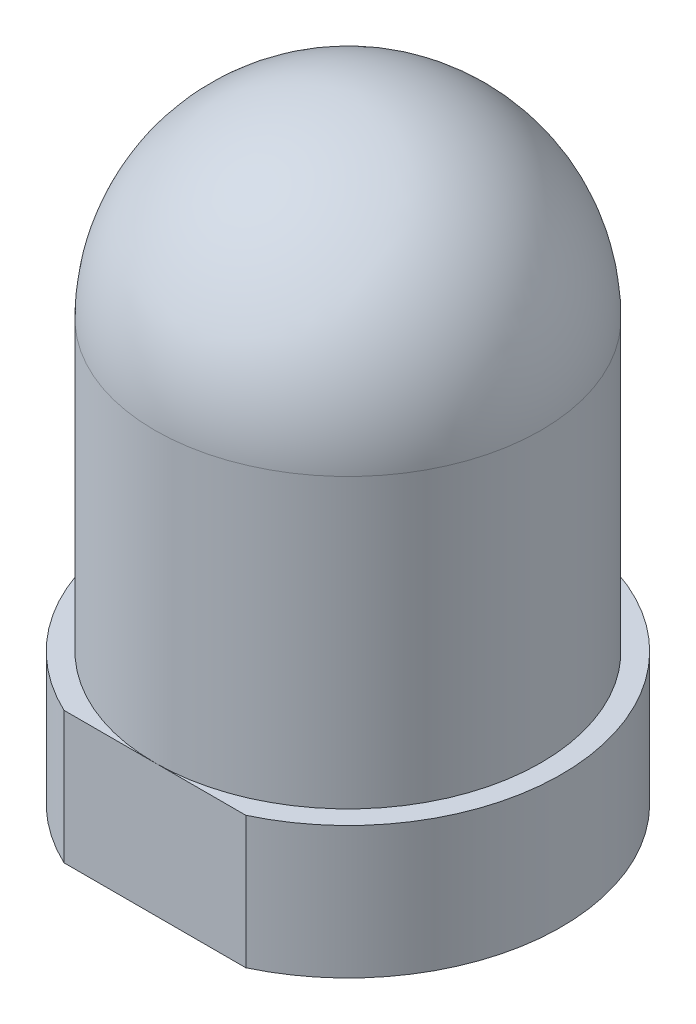
ISO-10303-21;
HEADER;
FILE_DESCRIPTION(('STEP AP214'),'2;1');
FILE_NAME('part.step','',(''),(''),'','','');
FILE_SCHEMA(('AUTOMOTIVE_DESIGN { 1 0 10303 214 1 1 1 1 }'));
ENDSEC;
DATA;
#1=APPLICATION_CONTEXT('core data for automotive mechanical design processes');
#2=APPLICATION_PROTOCOL_DEFINITION('international standard','automotive_design',2000,#1);
#3=PRODUCT_CONTEXT('',#1,'mechanical');
#4=PRODUCT('Part','Part','',(#3));
#5=PRODUCT_RELATED_PRODUCT_CATEGORY('part','',(#4));
#6=PRODUCT_DEFINITION_FORMATION('','',#4);
#7=PRODUCT_DEFINITION_CONTEXT('part definition',#1,'design');
#8=PRODUCT_DEFINITION('design','',#6,#7);
#9=PRODUCT_DEFINITION_SHAPE('','',#8);
#10=(LENGTH_UNIT() NAMED_UNIT(*) SI_UNIT(.MILLI.,.METRE.));
#11=(NAMED_UNIT(*) PLANE_ANGLE_UNIT() SI_UNIT($,.RADIAN.));
#12=(NAMED_UNIT(*) SI_UNIT($,.STERADIAN.) SOLID_ANGLE_UNIT());
#13=UNCERTAINTY_MEASURE_WITH_UNIT(LENGTH_MEASURE(1.E-05),#10,'distance_accuracy_value','');
#14=(GEOMETRIC_REPRESENTATION_CONTEXT(3) GLOBAL_UNCERTAINTY_ASSIGNED_CONTEXT((#13)) GLOBAL_UNIT_ASSIGNED_CONTEXT((#10,
#11,#12)) REPRESENTATION_CONTEXT('',''));
#15=CARTESIAN_POINT('',(0.,0.,0.));
#16=DIRECTION('',(0.,0.,1.));
#17=DIRECTION('',(1.,0.,0.));
#18=AXIS2_PLACEMENT_3D('',#15,#16,#17);
#19=CARTESIAN_POINT('',(0.,-0.9906,0.));
#20=DIRECTION('',(0.,-1.,0.));
#21=DIRECTION('',(0.,0.,-1.));
#22=AXIS2_PLACEMENT_3D('',#19,#20,#21);
#23=PLANE('',#22);
#24=CARTESIAN_POINT('',(0.,-0.9906,0.));
#25=DIRECTION('',(0.,1.,0.));
#26=DIRECTION('',(0.,0.,1.));
#27=AXIS2_PLACEMENT_3D('',#24,#25,#26);
#28=CIRCLE('',#27,1.6002);
#29=CARTESIAN_POINT('',(0.681553519541938,-0.9906,1.4478));
#30=VERTEX_POINT('',#29);
#31=CARTESIAN_POINT('',(-0.681553519541938,-0.9906,1.4478));
#32=VERTEX_POINT('',#31);
#33=EDGE_CURVE('E20',#30,#32,#28,.T.);
#34=ORIENTED_EDGE('',*,*,#33,.F.);
#35=DIRECTION('',(1.,0.,0.));
#36=VECTOR('',#35,1.);
#37=CARTESIAN_POINT('',(0.,-0.9906,1.4478));
#38=LINE('',#37,#36);
#39=EDGE_CURVE('E48',#30,#32,#38,.F.);
#40=ORIENTED_EDGE('',*,*,#39,.T.);
#41=EDGE_LOOP('',(#34,#40));
#42=FACE_BOUND('',#41,.T.);
#43=ADVANCED_FACE('F17',(#42),#23,.T.);
#44=CARTESIAN_POINT('',(0.,-0.9906,0.));
#45=DIRECTION('',(0.,1.,0.));
#46=DIRECTION('',(0.,0.,1.));
#47=AXIS2_PLACEMENT_3D('',#44,#45,#46);
#48=CYLINDRICAL_SURFACE('',#47,1.6002);
#49=ORIENTED_EDGE('',*,*,#33,.T.);
#50=DIRECTION('',(0.,1.,0.));
#51=VECTOR('',#50,1.);
#52=CARTESIAN_POINT('',(-0.681553519541938,-0.9906,1.4478));
#53=LINE('',#52,#51);
#54=CARTESIAN_POINT('',(-0.681553519541938,0.,1.4478));
#55=VERTEX_POINT('',#54);
#56=EDGE_CURVE('E57',#32,#55,#53,.T.);
#57=ORIENTED_EDGE('',*,*,#56,.T.);
#58=CARTESIAN_POINT('',(0.,0.,0.));
#59=DIRECTION('',(0.,1.,0.));
#60=DIRECTION('',(0.,0.,1.));
#61=AXIS2_PLACEMENT_3D('',#58,#59,#60);
#62=CIRCLE('',#61,1.6002);
#63=CARTESIAN_POINT('',(0.681553519541938,0.,1.4478));
#64=VERTEX_POINT('',#63);
#65=EDGE_CURVE('E63',#55,#64,#62,.F.);
#66=ORIENTED_EDGE('',*,*,#65,.T.);
#67=DIRECTION('',(0.,1.,0.));
#68=VECTOR('',#67,1.);
#69=CARTESIAN_POINT('',(0.681553519541938,-0.9906,1.4478));
#70=LINE('',#69,#68);
#71=EDGE_CURVE('E59',#64,#30,#70,.F.);
#72=ORIENTED_EDGE('',*,*,#71,.T.);
#73=EDGE_LOOP('',(#49,#57,#66,#72));
#74=FACE_BOUND('',#73,.T.);
#75=ADVANCED_FACE('F56',(#74),#48,.T.);
#76=CARTESIAN_POINT('',(0.681553519541938,-0.9906,1.4478));
#77=DIRECTION('',(0.,0.,-1.));
#78=DIRECTION('',(-1.,0.,0.));
#79=AXIS2_PLACEMENT_3D('',#76,#77,#78);
#80=PLANE('',#79);
#81=DIRECTION('',(-1.,0.,0.));
#82=VECTOR('',#81,1.);
#83=CARTESIAN_POINT('',(0.681553519541938,0.,1.4478));
#84=LINE('',#83,#82);
#85=EDGE_CURVE('E62',#64,#55,#84,.T.);
#86=ORIENTED_EDGE('',*,*,#85,.T.);
#87=ORIENTED_EDGE('',*,*,#56,.F.);
#88=ORIENTED_EDGE('',*,*,#39,.F.);
#89=ORIENTED_EDGE('',*,*,#71,.F.);
#90=EDGE_LOOP('',(#86,#87,#88,#89));
#91=FACE_BOUND('',#90,.T.);
#92=ADVANCED_FACE('F60',(#91),#80,.F.);
#93=CARTESIAN_POINT('',(0.,0.,0.));
#94=DIRECTION('',(0.,-1.,0.));
#95=DIRECTION('',(0.,0.,-1.));
#96=AXIS2_PLACEMENT_3D('',#93,#94,#95);
#97=PLANE('',#96);
#98=CARTESIAN_POINT('',(0.,0.,0.));
#99=DIRECTION('',(0.,-1.,0.));
#100=DIRECTION('',(0.,0.,-1.));
#101=AXIS2_PLACEMENT_3D('',#98,#99,#100);
#102=CIRCLE('',#101,1.4478);
#103=CARTESIAN_POINT('',(0.,0.,-1.4478));
#104=VERTEX_POINT('',#103);
#105=EDGE_CURVE('E26',#104,#104,#102,.F.);
#106=ORIENTED_EDGE('',*,*,#105,.F.);
#107=EDGE_LOOP('',(#106));
#108=FACE_BOUND('',#107,.T.);
#109=ORIENTED_EDGE('',*,*,#85,.F.);
#110=ORIENTED_EDGE('',*,*,#65,.F.);
#111=EDGE_LOOP('',(#109,#110));
#112=FACE_BOUND('',#111,.T.);
#113=ADVANCED_FACE('F83',(#108,#112),#97,.F.);
#114=CARTESIAN_POINT('',(0.,2.159,0.));
#115=DIRECTION('',(1.,0.,0.));
#116=DIRECTION('',(0.,-1.,0.));
#117=AXIS2_PLACEMENT_3D('',#114,#115,#116);
#118=SPHERICAL_SURFACE('',#117,1.4478);
#119=CARTESIAN_POINT('',(0.,2.159,0.));
#120=DIRECTION('',(0.,-1.,0.));
#121=DIRECTION('',(0.,0.,-1.));
#122=AXIS2_PLACEMENT_3D('',#119,#120,#121);
#123=CIRCLE('',#122,1.4478);
#124=CARTESIAN_POINT('',(-1.4478,2.159,0.));
#125=VERTEX_POINT('',#124);
#126=CARTESIAN_POINT('',(1.4478,2.159,0.));
#127=VERTEX_POINT('',#126);
#128=EDGE_CURVE('E11',#125,#127,#123,.T.);
#129=ORIENTED_EDGE('',*,*,#128,.F.);
#130=CARTESIAN_POINT('',(0.,2.159,0.));
#131=DIRECTION('',(0.,-1.,0.));
#132=DIRECTION('',(0.,0.,-1.));
#133=AXIS2_PLACEMENT_3D('',#130,#131,#132);
#134=CIRCLE('',#133,1.4478);
#135=EDGE_CURVE('E34',#127,#125,#134,.T.);
#136=ORIENTED_EDGE('',*,*,#135,.F.);
#137=EDGE_LOOP('',(#129,#136));
#138=FACE_BOUND('',#137,.T.);
#139=ADVANCED_FACE('F78',(#138),#118,.T.);
#140=CARTESIAN_POINT('',(0.,3.6068,0.));
#141=DIRECTION('',(0.,-1.,0.));
#142=DIRECTION('',(0.,0.,-1.));
#143=AXIS2_PLACEMENT_3D('',#140,#141,#142);
#144=CYLINDRICAL_SURFACE('',#143,1.4478);
#145=ORIENTED_EDGE('',*,*,#105,.T.);
#146=EDGE_LOOP('',(#145));
#147=FACE_BOUND('',#146,.T.);
#148=ORIENTED_EDGE('',*,*,#135,.T.);
#149=ORIENTED_EDGE('',*,*,#128,.T.);
#150=EDGE_LOOP('',(#148,#149));
#151=FACE_BOUND('',#150,.T.);
#152=ADVANCED_FACE('F82',(#147,#151),#144,.T.);
#153=CLOSED_SHELL('',(#43,#75,#92,#113,#139,#152));
#154=MANIFOLD_SOLID_BREP('B1',#153);
#155=ADVANCED_BREP_SHAPE_REPRESENTATION('',(#18,#154),#14);
#156=SHAPE_DEFINITION_REPRESENTATION(#9,#155);
ENDSEC;
END-ISO-10303-21;
